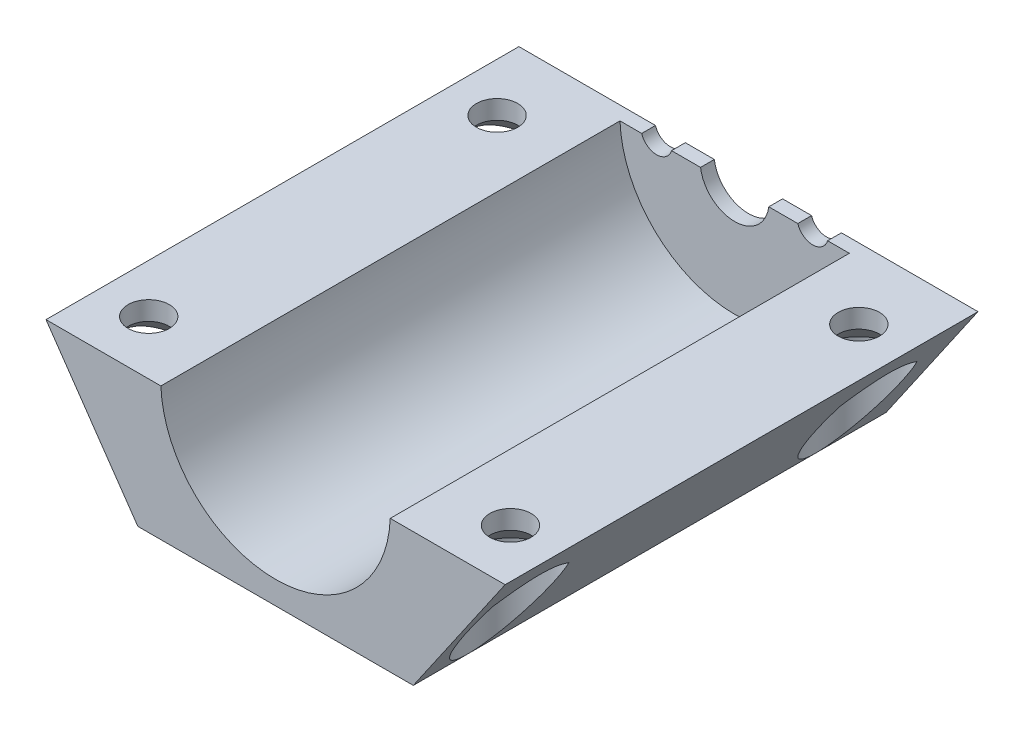
ISO-10303-21;
HEADER;
FILE_DESCRIPTION(('STEP AP214'),'2;1');
FILE_NAME('part.step','',(''),(''),'','','');
FILE_SCHEMA(('AUTOMOTIVE_DESIGN { 1 0 10303 214 1 1 1 1 }'));
ENDSEC;
DATA;
#1=APPLICATION_CONTEXT('core data for automotive mechanical design processes');
#2=APPLICATION_PROTOCOL_DEFINITION('international standard','automotive_design',2000,#1);
#3=PRODUCT_CONTEXT('',#1,'mechanical');
#4=PRODUCT('Part','Part','',(#3));
#5=PRODUCT_RELATED_PRODUCT_CATEGORY('part','',(#4));
#6=PRODUCT_DEFINITION_FORMATION('','',#4);
#7=PRODUCT_DEFINITION_CONTEXT('part definition',#1,'design');
#8=PRODUCT_DEFINITION('design','',#6,#7);
#9=PRODUCT_DEFINITION_SHAPE('','',#8);
#10=(LENGTH_UNIT() NAMED_UNIT(*) SI_UNIT(.MILLI.,.METRE.));
#11=(NAMED_UNIT(*) PLANE_ANGLE_UNIT() SI_UNIT($,.RADIAN.));
#12=(NAMED_UNIT(*) SI_UNIT($,.STERADIAN.) SOLID_ANGLE_UNIT());
#13=UNCERTAINTY_MEASURE_WITH_UNIT(LENGTH_MEASURE(1.E-05),#10,'distance_accuracy_value','');
#14=(GEOMETRIC_REPRESENTATION_CONTEXT(3) GLOBAL_UNCERTAINTY_ASSIGNED_CONTEXT((#13)) GLOBAL_UNIT_ASSIGNED_CONTEXT((#10,
#11,#12)) REPRESENTATION_CONTEXT('',''));
#15=CARTESIAN_POINT('',(0.,0.,0.));
#16=DIRECTION('',(0.,0.,1.));
#17=DIRECTION('',(1.,0.,0.));
#18=AXIS2_PLACEMENT_3D('',#15,#16,#17);
#19=CARTESIAN_POINT('',(0.,-0.499999999999995,0.));
#20=DIRECTION('',(0.,1.,0.));
#21=DIRECTION('',(0.,0.,1.));
#22=AXIS2_PLACEMENT_3D('',#19,#20,#21);
#23=PLANE('',#22);
#24=DIRECTION('',(0.,0.,1.));
#25=VECTOR('',#24,1.);
#26=CARTESIAN_POINT('',(-3.71651718682963,-0.499999999999995,-1.5));
#27=LINE('',#26,#25);
#28=CARTESIAN_POINT('',(-3.71651718682963,-0.499999999999995,-1.5));
#29=VERTEX_POINT('',#28);
#30=CARTESIAN_POINT('',(-3.71651718682963,-0.499999999999995,0.));
#31=VERTEX_POINT('',#30);
#32=EDGE_CURVE('E268',#29,#31,#27,.T.);
#33=ORIENTED_EDGE('',*,*,#32,.F.);
#34=DIRECTION('',(-1.,0.,0.));
#35=VECTOR('',#34,1.);
#36=CARTESIAN_POINT('',(0.,-0.499999999999995,-1.5));
#37=LINE('',#36,#35);
#38=CARTESIAN_POINT('',(-6.87519231907281,-0.499999999999996,-1.5));
#39=VERTEX_POINT('',#38);
#40=EDGE_CURVE('E250',#29,#39,#37,.T.);
#41=ORIENTED_EDGE('',*,*,#40,.T.);
#42=DIRECTION('',(0.,0.,-1.));
#43=VECTOR('',#42,1.);
#44=CARTESIAN_POINT('',(-6.87519231907281,-0.499999999999995,-1.5));
#45=LINE('',#44,#43);
#46=CARTESIAN_POINT('',(-6.87519231907281,-0.499999999999995,0.));
#47=VERTEX_POINT('',#46);
#48=EDGE_CURVE('E244',#39,#47,#45,.F.);
#49=ORIENTED_EDGE('',*,*,#48,.T.);
#50=DIRECTION('',(-1.,0.,0.));
#51=VECTOR('',#50,1.);
#52=CARTESIAN_POINT('',(0.,-0.499999999999995,0.));
#53=LINE('',#52,#51);
#54=EDGE_CURVE('E496',#31,#47,#53,.T.);
#55=ORIENTED_EDGE('',*,*,#54,.F.);
#56=EDGE_LOOP('',(#33,#41,#49,#55));
#57=FACE_BOUND('',#56,.T.);
#58=ADVANCED_FACE('F39',(#57),#23,.T.);
#59=CARTESIAN_POINT('',(-19.6986749407734,-0.499999999999995,44.1150104980837));
#60=DIRECTION('',(0.,1.,0.));
#61=DIRECTION('',(0.,0.,1.));
#62=AXIS2_PLACEMENT_3D('',#59,#60,#61);
#63=CIRCLE('',#62,2.25);
#64=CARTESIAN_POINT('',(-19.6986749407734,-0.499999999999995,46.3650104980837));
#65=VERTEX_POINT('',#64);
#66=EDGE_CURVE('E256',#65,#65,#63,.F.);
#67=ORIENTED_EDGE('',*,*,#66,.T.);
#68=EDGE_LOOP('',(#67));
#69=FACE_BOUND('',#68,.T.);
#70=DIRECTION('',(-1.,0.,0.));
#71=VECTOR('',#70,1.);
#72=CARTESIAN_POINT('',(0.,-0.499999999999995,50.));
#73=LINE('',#72,#71);
#74=CARTESIAN_POINT('',(-12.4899959967968,-0.499999999999995,50.));
#75=VERTEX_POINT('',#74);
#76=CARTESIAN_POINT('',(-25.,-0.500000000000001,50.));
#77=VERTEX_POINT('',#76);
#78=EDGE_CURVE('E239',#75,#77,#73,.T.);
#79=ORIENTED_EDGE('',*,*,#78,.F.);
#80=DIRECTION('',(0.,0.,-1.));
#81=VECTOR('',#80,1.);
#82=CARTESIAN_POINT('',(-12.4899959967968,-0.499999999999995,50.));
#83=LINE('',#82,#81);
#84=CARTESIAN_POINT('',(-12.4899959967968,-0.499999999999995,0.));
#85=VERTEX_POINT('',#84);
#86=EDGE_CURVE('E264',#85,#75,#83,.F.);
#87=ORIENTED_EDGE('',*,*,#86,.F.);
#88=CARTESIAN_POINT('',(-10.1248076809272,-0.499999999999995,0.));
#89=VERTEX_POINT('',#88);
#90=EDGE_CURVE('E241',#89,#85,#53,.T.);
#91=ORIENTED_EDGE('',*,*,#90,.F.);
#92=DIRECTION('',(0.,0.,-1.));
#93=VECTOR('',#92,1.);
#94=CARTESIAN_POINT('',(-10.1248076809272,-0.499999999999995,-1.5));
#95=LINE('',#94,#93);
#96=CARTESIAN_POINT('',(-10.1248076809272,-0.499999999999996,-1.5));
#97=VERTEX_POINT('',#96);
#98=EDGE_CURVE('E242',#89,#97,#95,.T.);
#99=ORIENTED_EDGE('',*,*,#98,.T.);
#100=CARTESIAN_POINT('',(-25.,-0.500000000000001,-1.5));
#101=VERTEX_POINT('',#100);
#102=EDGE_CURVE('E197',#97,#101,#37,.T.);
#103=ORIENTED_EDGE('',*,*,#102,.T.);
#104=DIRECTION('',(0.,0.,-1.));
#105=VECTOR('',#104,1.);
#106=CARTESIAN_POINT('',(-25.,-0.500000000000001,50.));
#107=LINE('',#106,#105);
#108=EDGE_CURVE('E273',#77,#101,#107,.T.);
#109=ORIENTED_EDGE('',*,*,#108,.F.);
#110=EDGE_LOOP('',(#79,#87,#91,#99,#103,#109));
#111=FACE_BOUND('',#110,.T.);
#112=CARTESIAN_POINT('',(-19.6986749407734,-0.499999999999995,6.17682172326088));
#113=DIRECTION('',(0.,1.,0.));
#114=DIRECTION('',(0.,0.,1.));
#115=AXIS2_PLACEMENT_3D('',#112,#113,#114);
#116=CIRCLE('',#115,2.25);
#117=CARTESIAN_POINT('',(-19.6986749407734,-0.499999999999995,8.42682172326087));
#118=VERTEX_POINT('',#117);
#119=EDGE_CURVE('E253',#118,#118,#116,.F.);
#120=ORIENTED_EDGE('',*,*,#119,.T.);
#121=EDGE_LOOP('',(#120));
#122=FACE_BOUND('',#121,.T.);
#123=ADVANCED_FACE('F390',(#69,#111,#122),#23,.T.);
#124=CARTESIAN_POINT('',(19.6986749407734,-0.499999999999995,44.1150104980837));
#125=DIRECTION('',(0.,1.,0.));
#126=DIRECTION('',(0.,0.,1.));
#127=AXIS2_PLACEMENT_3D('',#124,#125,#126);
#128=CIRCLE('',#127,2.25);
#129=CARTESIAN_POINT('',(19.6986749407734,-0.499999999999995,46.3650104980837));
#130=VERTEX_POINT('',#129);
#131=EDGE_CURVE('E259',#130,#130,#128,.F.);
#132=ORIENTED_EDGE('',*,*,#131,.T.);
#133=EDGE_LOOP('',(#132));
#134=FACE_BOUND('',#133,.T.);
#135=CARTESIAN_POINT('',(25.,-0.499999999999995,50.));
#136=VERTEX_POINT('',#135);
#137=CARTESIAN_POINT('',(12.4899959967968,-0.499999999999995,50.));
#138=VERTEX_POINT('',#137);
#139=EDGE_CURVE('E202',#136,#138,#73,.T.);
#140=ORIENTED_EDGE('',*,*,#139,.F.);
#141=DIRECTION('',(0.,0.,-1.));
#142=VECTOR('',#141,1.);
#143=CARTESIAN_POINT('',(25.,-0.499999999999995,50.));
#144=LINE('',#143,#142);
#145=CARTESIAN_POINT('',(25.,-0.499999999999995,-1.5));
#146=VERTEX_POINT('',#145);
#147=EDGE_CURVE('E182',#136,#146,#144,.T.);
#148=ORIENTED_EDGE('',*,*,#147,.T.);
#149=CARTESIAN_POINT('',(10.1248076809272,-0.499999999999996,-1.5));
#150=VERTEX_POINT('',#149);
#151=EDGE_CURVE('E188',#146,#150,#37,.T.);
#152=ORIENTED_EDGE('',*,*,#151,.T.);
#153=DIRECTION('',(0.,0.,-1.));
#154=VECTOR('',#153,1.);
#155=CARTESIAN_POINT('',(10.1248076809272,-0.499999999999995,-1.5));
#156=LINE('',#155,#154);
#157=CARTESIAN_POINT('',(10.1248076809272,-0.499999999999995,0.));
#158=VERTEX_POINT('',#157);
#159=EDGE_CURVE('E206',#150,#158,#156,.F.);
#160=ORIENTED_EDGE('',*,*,#159,.T.);
#161=CARTESIAN_POINT('',(12.4899959967968,-0.499999999999995,0.));
#162=VERTEX_POINT('',#161);
#163=EDGE_CURVE('E234',#162,#158,#53,.T.);
#164=ORIENTED_EDGE('',*,*,#163,.F.);
#165=DIRECTION('',(0.,0.,-1.));
#166=VECTOR('',#165,1.);
#167=CARTESIAN_POINT('',(12.4899959967968,-0.499999999999995,50.));
#168=LINE('',#167,#166);
#169=EDGE_CURVE('E262',#138,#162,#168,.T.);
#170=ORIENTED_EDGE('',*,*,#169,.F.);
#171=EDGE_LOOP('',(#140,#148,#152,#160,#164,#170));
#172=FACE_BOUND('',#171,.T.);
#173=CARTESIAN_POINT('',(19.6986749407734,-0.499999999999995,6.17682172326088));
#174=DIRECTION('',(0.,1.,0.));
#175=DIRECTION('',(0.,0.,1.));
#176=AXIS2_PLACEMENT_3D('',#173,#174,#175);
#177=CIRCLE('',#176,2.25);
#178=CARTESIAN_POINT('',(19.6986749407734,-0.499999999999995,8.42682172326087));
#179=VERTEX_POINT('',#178);
#180=EDGE_CURVE('E194',#179,#179,#177,.F.);
#181=ORIENTED_EDGE('',*,*,#180,.T.);
#182=EDGE_LOOP('',(#181));
#183=FACE_BOUND('',#182,.T.);
#184=ADVANCED_FACE('F199',(#134,#172,#183),#23,.T.);
#185=DIRECTION('',(0.,0.,1.));
#186=VECTOR('',#185,1.);
#187=CARTESIAN_POINT('',(3.71651718682963,-0.499999999999995,-1.5));
#188=LINE('',#187,#186);
#189=CARTESIAN_POINT('',(3.71651718682963,-0.499999999999995,0.));
#190=VERTEX_POINT('',#189);
#191=CARTESIAN_POINT('',(3.71651718682963,-0.499999999999995,-1.5));
#192=VERTEX_POINT('',#191);
#193=EDGE_CURVE('E270',#190,#192,#188,.F.);
#194=ORIENTED_EDGE('',*,*,#193,.F.);
#195=CARTESIAN_POINT('',(6.87519231907281,-0.499999999999995,0.));
#196=VERTEX_POINT('',#195);
#197=EDGE_CURVE('E238',#196,#190,#53,.T.);
#198=ORIENTED_EDGE('',*,*,#197,.F.);
#199=DIRECTION('',(0.,0.,-1.));
#200=VECTOR('',#199,1.);
#201=CARTESIAN_POINT('',(6.87519231907281,-0.499999999999995,-1.5));
#202=LINE('',#201,#200);
#203=CARTESIAN_POINT('',(6.87519231907281,-0.499999999999996,-1.5));
#204=VERTEX_POINT('',#203);
#205=EDGE_CURVE('E203',#196,#204,#202,.T.);
#206=ORIENTED_EDGE('',*,*,#205,.T.);
#207=EDGE_CURVE('E195',#204,#192,#37,.T.);
#208=ORIENTED_EDGE('',*,*,#207,.T.);
#209=EDGE_LOOP('',(#194,#198,#206,#208));
#210=FACE_BOUND('',#209,.T.);
#211=ADVANCED_FACE('F379',(#210),#23,.T.);
#212=CARTESIAN_POINT('',(0.,0.,50.));
#213=DIRECTION('',(0.,0.,-1.));
#214=DIRECTION('',(-1.,0.,0.));
#215=AXIS2_PLACEMENT_3D('',#212,#213,#214);
#216=CYLINDRICAL_SURFACE('',#215,12.5);
#217=CARTESIAN_POINT('',(0.,0.,50.));
#218=DIRECTION('',(0.,0.,1.));
#219=DIRECTION('',(1.,0.,0.));
#220=AXIS2_PLACEMENT_3D('',#217,#218,#219);
#221=CIRCLE('',#220,12.5);
#222=EDGE_CURVE('E210',#75,#138,#221,.T.);
#223=ORIENTED_EDGE('',*,*,#222,.T.);
#224=ORIENTED_EDGE('',*,*,#169,.T.);
#225=CARTESIAN_POINT('',(0.,0.,0.));
#226=DIRECTION('',(0.,0.,1.));
#227=DIRECTION('',(1.,0.,0.));
#228=AXIS2_PLACEMENT_3D('',#225,#226,#227);
#229=CIRCLE('',#228,12.5);
#230=EDGE_CURVE('E214',#85,#162,#229,.T.);
#231=ORIENTED_EDGE('',*,*,#230,.F.);
#232=ORIENTED_EDGE('',*,*,#86,.T.);
#233=EDGE_LOOP('',(#223,#224,#231,#232));
#234=FACE_BOUND('',#233,.T.);
#235=ADVANCED_FACE('F377',(#234),#216,.F.);
#236=CARTESIAN_POINT('',(0.,0.,50.));
#237=DIRECTION('',(0.,0.,1.));
#238=DIRECTION('',(1.,0.,0.));
#239=AXIS2_PLACEMENT_3D('',#236,#237,#238);
#240=PLANE('',#239);
#241=DIRECTION('',(0.567732955803659,0.823212785915306,0.));
#242=VECTOR('',#241,1.);
#243=CARTESIAN_POINT('',(17.1756647864625,-11.8452860596293,50.));
#244=LINE('',#243,#242);
#245=CARTESIAN_POINT('',(15.,-15.,50.));
#246=VERTEX_POINT('',#245);
#247=EDGE_CURVE('E213',#246,#136,#244,.T.);
#248=ORIENTED_EDGE('',*,*,#247,.T.);
#249=ORIENTED_EDGE('',*,*,#139,.T.);
#250=ORIENTED_EDGE('',*,*,#222,.F.);
#251=ORIENTED_EDGE('',*,*,#78,.T.);
#252=DIRECTION('',(0.56773295580366,-0.823212785915306,0.));
#253=VECTOR('',#252,1.);
#254=CARTESIAN_POINT('',(-17.1756647864625,-11.8452860596293,50.));
#255=LINE('',#254,#253);
#256=CARTESIAN_POINT('',(-15.,-15.,50.));
#257=VERTEX_POINT('',#256);
#258=EDGE_CURVE('E218',#77,#257,#255,.T.);
#259=ORIENTED_EDGE('',*,*,#258,.T.);
#260=DIRECTION('',(-1.,0.,0.));
#261=VECTOR('',#260,1.);
#262=CARTESIAN_POINT('',(0.,-15.,50.));
#263=LINE('',#262,#261);
#264=EDGE_CURVE('E310',#246,#257,#263,.T.);
#265=ORIENTED_EDGE('',*,*,#264,.F.);
#266=EDGE_LOOP('',(#248,#249,#250,#251,#259,#265));
#267=FACE_BOUND('',#266,.T.);
#268=ADVANCED_FACE('F41',(#267),#240,.T.);
#269=CARTESIAN_POINT('',(19.6986749407734,-15.,44.1150104980837));
#270=DIRECTION('',(0.,-1.,0.));
#271=DIRECTION('',(0.,0.,-1.));
#272=AXIS2_PLACEMENT_3D('',#269,#270,#271);
#273=CYLINDRICAL_SURFACE('',#272,2.25);
#274=CARTESIAN_POINT('',(19.6986749407734,-2.55,44.1150104980837));
#275=DIRECTION('',(0.,-1.,0.));
#276=DIRECTION('',(0.,0.,-1.));
#277=AXIS2_PLACEMENT_3D('',#274,#275,#276);
#278=CIRCLE('',#277,2.25);
#279=CARTESIAN_POINT('',(19.6986749407734,-2.55,41.8650104980837));
#280=VERTEX_POINT('',#279);
#281=EDGE_CURVE('E217',#280,#280,#278,.T.);
#282=ORIENTED_EDGE('',*,*,#281,.T.);
#283=EDGE_LOOP('',(#282));
#284=FACE_BOUND('',#283,.T.);
#285=ORIENTED_EDGE('',*,*,#131,.F.);
#286=EDGE_LOOP('',(#285));
#287=FACE_BOUND('',#286,.T.);
#288=ADVANCED_FACE('F386',(#284,#287),#273,.F.);
#289=CARTESIAN_POINT('',(-19.6986749407734,-15.,44.1150104980837));
#290=DIRECTION('',(0.,-1.,0.));
#291=DIRECTION('',(0.,0.,-1.));
#292=AXIS2_PLACEMENT_3D('',#289,#290,#291);
#293=CYLINDRICAL_SURFACE('',#292,2.25);
#294=CARTESIAN_POINT('',(-19.6986749407734,-2.55000000000001,44.1150104980837));
#295=DIRECTION('',(0.,-1.,0.));
#296=DIRECTION('',(0.,0.,-1.));
#297=AXIS2_PLACEMENT_3D('',#294,#295,#296);
#298=CIRCLE('',#297,2.25);
#299=CARTESIAN_POINT('',(-19.6986749407734,-2.55000000000001,41.8650104980837));
#300=VERTEX_POINT('',#299);
#301=EDGE_CURVE('E300',#300,#300,#298,.T.);
#302=ORIENTED_EDGE('',*,*,#301,.T.);
#303=EDGE_LOOP('',(#302));
#304=FACE_BOUND('',#303,.T.);
#305=ORIENTED_EDGE('',*,*,#66,.F.);
#306=EDGE_LOOP('',(#305));
#307=FACE_BOUND('',#306,.T.);
#308=ADVANCED_FACE('F414',(#304,#307),#293,.F.);
#309=CARTESIAN_POINT('',(-19.6986749407734,-15.,6.17682172326088));
#310=DIRECTION('',(0.,-1.,0.));
#311=DIRECTION('',(0.,0.,-1.));
#312=AXIS2_PLACEMENT_3D('',#309,#310,#311);
#313=CYLINDRICAL_SURFACE('',#312,2.25);
#314=CARTESIAN_POINT('',(-19.6986749407734,-2.55000000000001,6.17682172326088));
#315=DIRECTION('',(0.,-1.,0.));
#316=DIRECTION('',(0.,0.,-1.));
#317=AXIS2_PLACEMENT_3D('',#314,#315,#316);
#318=CIRCLE('',#317,2.25);
#319=CARTESIAN_POINT('',(-19.6986749407734,-2.55000000000001,3.92682172326088));
#320=VERTEX_POINT('',#319);
#321=EDGE_CURVE('E292',#320,#320,#318,.T.);
#322=ORIENTED_EDGE('',*,*,#321,.T.);
#323=EDGE_LOOP('',(#322));
#324=FACE_BOUND('',#323,.T.);
#325=ORIENTED_EDGE('',*,*,#119,.F.);
#326=EDGE_LOOP('',(#325));
#327=FACE_BOUND('',#326,.T.);
#328=ADVANCED_FACE('F410',(#324,#327),#313,.F.);
#329=CARTESIAN_POINT('',(19.6986749407734,-15.,6.17682172326088));
#330=DIRECTION('',(0.,-1.,0.));
#331=DIRECTION('',(0.,0.,-1.));
#332=AXIS2_PLACEMENT_3D('',#329,#330,#331);
#333=CYLINDRICAL_SURFACE('',#332,2.25);
#334=CARTESIAN_POINT('',(19.6986749407734,-2.55,6.17682172326088));
#335=DIRECTION('',(0.,-1.,0.));
#336=DIRECTION('',(0.,0.,-1.));
#337=AXIS2_PLACEMENT_3D('',#334,#335,#336);
#338=CIRCLE('',#337,2.25);
#339=CARTESIAN_POINT('',(19.6986749407734,-2.55,3.92682172326088));
#340=VERTEX_POINT('',#339);
#341=EDGE_CURVE('E285',#340,#340,#338,.T.);
#342=ORIENTED_EDGE('',*,*,#341,.T.);
#343=EDGE_LOOP('',(#342));
#344=FACE_BOUND('',#343,.T.);
#345=ORIENTED_EDGE('',*,*,#180,.F.);
#346=EDGE_LOOP('',(#345));
#347=FACE_BOUND('',#346,.T.);
#348=ADVANCED_FACE('F395',(#344,#347),#333,.F.);
#349=CARTESIAN_POINT('',(0.,0.,0.));
#350=DIRECTION('',(0.,0.,1.));
#351=DIRECTION('',(1.,0.,0.));
#352=AXIS2_PLACEMENT_3D('',#349,#350,#351);
#353=PLANE('',#352);
#354=ORIENTED_EDGE('',*,*,#230,.T.);
#355=ORIENTED_EDGE('',*,*,#163,.T.);
#356=CARTESIAN_POINT('',(8.5,0.,0.));
#357=DIRECTION('',(0.,0.,1.));
#358=DIRECTION('',(1.,0.,0.));
#359=AXIS2_PLACEMENT_3D('',#356,#357,#358);
#360=CIRCLE('',#359,1.7);
#361=EDGE_CURVE('E47',#196,#158,#360,.T.);
#362=ORIENTED_EDGE('',*,*,#361,.F.);
#363=ORIENTED_EDGE('',*,*,#197,.T.);
#364=CARTESIAN_POINT('',(0.,0.,0.));
#365=DIRECTION('',(0.,0.,-1.));
#366=DIRECTION('',(-1.,0.,0.));
#367=AXIS2_PLACEMENT_3D('',#364,#365,#366);
#368=CIRCLE('',#367,3.75);
#369=EDGE_CURVE('E221',#190,#31,#368,.T.);
#370=ORIENTED_EDGE('',*,*,#369,.T.);
#371=ORIENTED_EDGE('',*,*,#54,.T.);
#372=CARTESIAN_POINT('',(-8.5,0.,0.));
#373=DIRECTION('',(0.,0.,1.));
#374=DIRECTION('',(1.,0.,0.));
#375=AXIS2_PLACEMENT_3D('',#372,#373,#374);
#376=CIRCLE('',#375,1.7);
#377=EDGE_CURVE('E224',#89,#47,#376,.T.);
#378=ORIENTED_EDGE('',*,*,#377,.F.);
#379=ORIENTED_EDGE('',*,*,#90,.T.);
#380=EDGE_LOOP('',(#354,#355,#362,#363,#370,#371,#378,#379));
#381=FACE_BOUND('',#380,.T.);
#382=ADVANCED_FACE('F235',(#381),#353,.T.);
#383=CARTESIAN_POINT('',(0.,0.,-1.5));
#384=DIRECTION('',(0.,0.,1.));
#385=DIRECTION('',(1.,0.,0.));
#386=AXIS2_PLACEMENT_3D('',#383,#384,#385);
#387=PLANE('',#386);
#388=ORIENTED_EDGE('',*,*,#151,.F.);
#389=DIRECTION('',(-0.567732955803659,-0.823212785915306,0.));
#390=VECTOR('',#389,1.);
#391=CARTESIAN_POINT('',(15.,-15.,-1.5));
#392=LINE('',#391,#390);
#393=CARTESIAN_POINT('',(15.,-15.,-1.5));
#394=VERTEX_POINT('',#393);
#395=EDGE_CURVE('E176',#146,#394,#392,.T.);
#396=ORIENTED_EDGE('',*,*,#395,.T.);
#397=DIRECTION('',(-1.,0.,0.));
#398=VECTOR('',#397,1.);
#399=CARTESIAN_POINT('',(-15.,-15.,-1.5));
#400=LINE('',#399,#398);
#401=CARTESIAN_POINT('',(-15.,-15.,-1.5));
#402=VERTEX_POINT('',#401);
#403=EDGE_CURVE('E185',#394,#402,#400,.T.);
#404=ORIENTED_EDGE('',*,*,#403,.T.);
#405=DIRECTION('',(-0.56773295580366,0.823212785915306,0.));
#406=VECTOR('',#405,1.);
#407=CARTESIAN_POINT('',(-25.,-0.500000000000001,-1.5));
#408=LINE('',#407,#406);
#409=EDGE_CURVE('E278',#402,#101,#408,.T.);
#410=ORIENTED_EDGE('',*,*,#409,.T.);
#411=ORIENTED_EDGE('',*,*,#102,.F.);
#412=CARTESIAN_POINT('',(-8.5,0.,-1.5));
#413=DIRECTION('',(0.,0.,-1.));
#414=DIRECTION('',(-1.,0.,0.));
#415=AXIS2_PLACEMENT_3D('',#412,#413,#414);
#416=CIRCLE('',#415,1.7);
#417=EDGE_CURVE('E226',#39,#97,#416,.T.);
#418=ORIENTED_EDGE('',*,*,#417,.F.);
#419=ORIENTED_EDGE('',*,*,#40,.F.);
#420=CARTESIAN_POINT('',(0.,0.,-1.5));
#421=DIRECTION('',(0.,0.,-1.));
#422=DIRECTION('',(-1.,0.,0.));
#423=AXIS2_PLACEMENT_3D('',#420,#421,#422);
#424=CIRCLE('',#423,3.75);
#425=EDGE_CURVE('E184',#192,#29,#424,.T.);
#426=ORIENTED_EDGE('',*,*,#425,.F.);
#427=ORIENTED_EDGE('',*,*,#207,.F.);
#428=CARTESIAN_POINT('',(8.5,0.,-1.5));
#429=DIRECTION('',(0.,0.,-1.));
#430=DIRECTION('',(-1.,0.,0.));
#431=AXIS2_PLACEMENT_3D('',#428,#429,#430);
#432=CIRCLE('',#431,1.7);
#433=EDGE_CURVE('E11',#150,#204,#432,.T.);
#434=ORIENTED_EDGE('',*,*,#433,.F.);
#435=EDGE_LOOP('',(#388,#396,#404,#410,#411,#418,#419,#426,#427,#434));
#436=FACE_BOUND('',#435,.T.);
#437=ADVANCED_FACE('F189',(#436),#387,.F.);
#438=CARTESIAN_POINT('',(0.,0.,-1.5));
#439=DIRECTION('',(0.,0.,1.));
#440=DIRECTION('',(1.,0.,0.));
#441=AXIS2_PLACEMENT_3D('',#438,#439,#440);
#442=CYLINDRICAL_SURFACE('',#441,3.75);
#443=ORIENTED_EDGE('',*,*,#425,.T.);
#444=ORIENTED_EDGE('',*,*,#32,.T.);
#445=ORIENTED_EDGE('',*,*,#369,.F.);
#446=ORIENTED_EDGE('',*,*,#193,.T.);
#447=EDGE_LOOP('',(#443,#444,#445,#446));
#448=FACE_BOUND('',#447,.T.);
#449=ADVANCED_FACE('F398',(#448),#442,.F.);
#450=CARTESIAN_POINT('',(-8.5,0.,-1.5));
#451=DIRECTION('',(0.,0.,-1.));
#452=DIRECTION('',(-1.,0.,0.));
#453=AXIS2_PLACEMENT_3D('',#450,#451,#452);
#454=CYLINDRICAL_SURFACE('',#453,1.7);
#455=ORIENTED_EDGE('',*,*,#48,.F.);
#456=ORIENTED_EDGE('',*,*,#417,.T.);
#457=ORIENTED_EDGE('',*,*,#98,.F.);
#458=ORIENTED_EDGE('',*,*,#377,.T.);
#459=EDGE_LOOP('',(#455,#456,#457,#458));
#460=FACE_BOUND('',#459,.T.);
#461=ADVANCED_FACE('F401',(#460),#454,.F.);
#462=CARTESIAN_POINT('',(8.5,0.,-1.5));
#463=DIRECTION('',(0.,0.,-1.));
#464=DIRECTION('',(-1.,0.,0.));
#465=AXIS2_PLACEMENT_3D('',#462,#463,#464);
#466=CYLINDRICAL_SURFACE('',#465,1.7);
#467=ORIENTED_EDGE('',*,*,#159,.F.);
#468=ORIENTED_EDGE('',*,*,#433,.T.);
#469=ORIENTED_EDGE('',*,*,#205,.F.);
#470=ORIENTED_EDGE('',*,*,#361,.T.);
#471=EDGE_LOOP('',(#467,#468,#469,#470));
#472=FACE_BOUND('',#471,.T.);
#473=ADVANCED_FACE('F230',(#472),#466,.F.);
#474=CARTESIAN_POINT('',(-17.1756647864625,-11.8452860596293,50.));
#475=DIRECTION('',(0.823212785915306,0.56773295580366,0.));
#476=DIRECTION('',(-0.56773295580366,0.823212785915306,0.));
#477=AXIS2_PLACEMENT_3D('',#474,#475,#476);
#478=PLANE('',#477);
#479=DIRECTION('',(0.,0.,-1.));
#480=VECTOR('',#479,1.);
#481=CARTESIAN_POINT('',(-15.,-15.,50.));
#482=LINE('',#481,#480);
#483=CARTESIAN_POINT('',(-15.,-15.,6.06522512408229));
#484=VERTEX_POINT('',#483);
#485=EDGE_CURVE('E62',#484,#402,#482,.T.);
#486=ORIENTED_EDGE('',*,*,#485,.F.);
#487=CARTESIAN_POINT('',(-19.6986749407734,-8.18692133587859,6.17682172326088));
#488=DIRECTION('',(0.823212785915306,0.56773295580366,0.));
#489=DIRECTION('',(0.56773295580366,-0.823212785915306,0.));
#490=AXIS2_PLACEMENT_3D('',#487,#488,#489);
#491=ELLIPSE('',#490,8.27854002829001,4.7);
#492=CARTESIAN_POINT('',(-21.8965517241379,-5.00000000000001,2.02238582350901));
#493=VERTEX_POINT('',#492);
#494=EDGE_CURVE('E454',#484,#493,#491,.T.);
#495=ORIENTED_EDGE('',*,*,#494,.T.);
#496=CARTESIAN_POINT('',(-21.8964137931034,-5.00020000000001,2.02208659608864));
#497=CARTESIAN_POINT('',(-21.9373934271764,-4.94077953059417,2.11099607729211));
#498=CARTESIAN_POINT('',(-21.9777748105248,-4.88222652473908,2.20077196587641));
#499=CARTESIAN_POINT('',(-22.0571709610869,-4.76710210642407,2.38221815874885));
#500=CARTESIAN_POINT('',(-22.0961853373366,-4.71053126086198,2.47388899326357));
#501=CARTESIAN_POINT('',(-22.1728379380114,-4.59938498988347,2.65968246153815));
#502=CARTESIAN_POINT('',(-22.2104686345403,-4.54482047991664,2.75381477289246));
#503=CARTESIAN_POINT('',(-22.2839235687901,-4.43831082525439,2.94422576701021));
#504=CARTESIAN_POINT('',(-22.3197479423952,-4.38636548352702,3.04050428753281));
#505=CARTESIAN_POINT('',(-22.4257208302335,-4.2327047961614,3.3371804711165));
#506=CARTESIAN_POINT('',(-22.4926198969123,-4.13570114947711,3.54125112017009));
#507=CARTESIAN_POINT('',(-22.6150268275729,-3.95821110001936,3.9594312417019));
#508=CARTESIAN_POINT('',(-22.6705574585779,-3.87769168506198,4.1735195739858));
#509=CARTESIAN_POINT('',(-22.746876536482,-3.76702902210104,4.52026274031542));
#510=CARTESIAN_POINT('',(-22.7724942725224,-3.72988330484246,4.64963065789284));
#511=CARTESIAN_POINT('',(-22.8180673442797,-3.66380235079447,4.91147036485367));
#512=CARTESIAN_POINT('',(-22.8380223406349,-3.63486760607939,5.04394233974492));
#513=CARTESIAN_POINT('',(-22.8714737810932,-3.58636301741493,5.31032470265428));
#514=CARTESIAN_POINT('',(-22.8850196154814,-3.56672155755191,5.44421568146456));
#515=CARTESIAN_POINT('',(-22.9053755645646,-3.53720543138133,5.71358576473854));
#516=CARTESIAN_POINT('',(-22.9121861134567,-3.52733013548784,5.84906476625888));
#517=CARTESIAN_POINT('',(-22.9188159383459,-3.5177168893984,6.12149679094143));
#518=CARTESIAN_POINT('',(-22.9185866142384,-3.51804940935436,6.25845353268023));
#519=CARTESIAN_POINT('',(-22.9110264652226,-3.52901162542721,6.53175163809029));
#520=CARTESIAN_POINT('',(-22.903695538333,-3.53964146941715,6.66809299289612));
#521=CARTESIAN_POINT('',(-22.8822021744114,-3.57080684710348,6.93950185027654));
#522=CARTESIAN_POINT('',(-22.8680190073661,-3.5913724393192,7.0745642110391));
#523=CARTESIAN_POINT('',(-22.8333502818238,-3.64164209135553,7.34214032919437));
#524=CARTESIAN_POINT('',(-22.8128638985143,-3.67134734715424,7.4746537506309));
#525=CARTESIAN_POINT('',(-22.7574796690486,-3.75165447987956,7.7858508191377));
#526=CARTESIAN_POINT('',(-22.7200597192865,-3.80591340703454,7.96314295498938));
#527=CARTESIAN_POINT('',(-22.6363785439314,-3.92725111129942,8.31112566688612));
#528=CARTESIAN_POINT('',(-22.5901124004487,-3.99433701934934,8.48181250706498));
#529=CARTESIAN_POINT('',(-22.4903273841325,-4.13902529300784,8.81693326988787));
#530=CARTESIAN_POINT('',(-22.436791364168,-4.21665252195643,8.98135119525801));
#531=CARTESIAN_POINT('',(-22.3239900186616,-4.38021447294064,9.30385901442699));
#532=CARTESIAN_POINT('',(-22.2647262336835,-4.46614696115887,9.46195059369962));
#533=CARTESIAN_POINT('',(-22.1544716766579,-4.62601606884606,9.73995852175721));
#534=CARTESIAN_POINT('',(-22.1043422341814,-4.69870376043702,9.86094503992901));
#535=CARTESIAN_POINT('',(-22.0019370341949,-4.84719130041736,10.0989473947043));
#536=CARTESIAN_POINT('',(-21.9496757236123,-4.92297020076222,10.2159824826666));
#537=CARTESIAN_POINT('',(-21.8964137931034,-5.0002,10.3315568504331));
#538=B_SPLINE_CURVE_WITH_KNOTS('',3,(#496,#497,#498,#499,#500,#501,#502,#503,#504,#505,#506,
#507,#508,#509,#510,#511,#512,#513,#514,#515,#516,#517,#518,#519,#520,#521,#522,#523,#524,#525,
#526,#527,#528,#529,#530,#531,#532,#533,#534,#535,#536,#537),.UNSPECIFIED.,.F.,.F.,(4,2,2,2,2,2,
2,2,2,2,2,2,2,2,2,2,2,2,2,2,4),(0.,0.34356635423382,0.687230179454416,1.03254819810146,
1.37784020066393,2.08393733373427,2.78860626045945,3.19930436697554,3.61002708097046,
4.01753094644687,4.42500854004923,4.83529980353476,5.2455969590288,5.6571432298096,
6.06874337673223,6.63523820846969,7.20204889382847,7.77022049510812,8.33823970160977,
8.78748480662515,9.23407302310803),.UNSPECIFIED.);
#539=CARTESIAN_POINT('',(-21.8965517241379,-5.00000000000001,10.3312576230127));
#540=VERTEX_POINT('',#539);
#541=EDGE_CURVE('E360',#493,#540,#538,.T.);
#542=ORIENTED_EDGE('',*,*,#541,.T.);
#543=CARTESIAN_POINT('',(-15.,-15.,6.28841832243947));
#544=VERTEX_POINT('',#543);
#545=EDGE_CURVE('E456',#540,#544,#491,.T.);
#546=ORIENTED_EDGE('',*,*,#545,.T.);
#547=CARTESIAN_POINT('',(-15.,-15.,44.0034138989051));
#548=VERTEX_POINT('',#547);
#549=EDGE_CURVE('E320',#548,#544,#482,.T.);
#550=ORIENTED_EDGE('',*,*,#549,.F.);
#551=CARTESIAN_POINT('',(-19.6986749407734,-8.18692133587859,44.1150104980837));
#552=DIRECTION('',(0.823212785915306,0.56773295580366,0.));
#553=DIRECTION('',(0.56773295580366,-0.823212785915306,0.));
#554=AXIS2_PLACEMENT_3D('',#551,#552,#553);
#555=ELLIPSE('',#554,8.27854002829001,4.7);
#556=CARTESIAN_POINT('',(-21.8965517241379,-5.00000000000001,39.9605745983319));
#557=VERTEX_POINT('',#556);
#558=EDGE_CURVE('E359',#548,#557,#555,.T.);
#559=ORIENTED_EDGE('',*,*,#558,.T.);
#560=CARTESIAN_POINT('',(-21.8964137931034,-5.00020000000001,39.9602753709115));
#561=CARTESIAN_POINT('',(-21.9373934271764,-4.94077953059417,40.049184852115));
#562=CARTESIAN_POINT('',(-21.9777748105248,-4.88222652473908,40.1389607406993));
#563=CARTESIAN_POINT('',(-22.0571709610869,-4.76710210642406,40.3204069335717));
#564=CARTESIAN_POINT('',(-22.0961853373366,-4.71053126086198,40.4120777680864));
#565=CARTESIAN_POINT('',(-22.1728379380114,-4.59938498988347,40.597871236361));
#566=CARTESIAN_POINT('',(-22.2104686345403,-4.54482047991664,40.6920035477153));
#567=CARTESIAN_POINT('',(-22.2839235687901,-4.43831082525439,40.8824145418331));
#568=CARTESIAN_POINT('',(-22.3197479423952,-4.38636548352702,40.9786930623557));
#569=CARTESIAN_POINT('',(-22.4257208302335,-4.2327047961614,41.2753692459393));
#570=CARTESIAN_POINT('',(-22.4926198969123,-4.13570114947711,41.4794398949929));
#571=CARTESIAN_POINT('',(-22.6150268275729,-3.95821110001936,41.8976200165247));
#572=CARTESIAN_POINT('',(-22.6705574585779,-3.87769168506198,42.1117083488086));
#573=CARTESIAN_POINT('',(-22.746876536482,-3.76702902210104,42.4584515151383));
#574=CARTESIAN_POINT('',(-22.7724942725224,-3.72988330484246,42.5878194327157));
#575=CARTESIAN_POINT('',(-22.8180673442797,-3.66380235079447,42.8496591396765));
#576=CARTESIAN_POINT('',(-22.8380223406349,-3.63486760607939,42.9821311145678));
#577=CARTESIAN_POINT('',(-22.8714737810932,-3.58636301741493,43.2485134774771));
#578=CARTESIAN_POINT('',(-22.8850196154814,-3.56672155755191,43.3824044562874));
#579=CARTESIAN_POINT('',(-22.9053755645646,-3.53720543138133,43.6517745395614));
#580=CARTESIAN_POINT('',(-22.9121861134567,-3.52733013548784,43.7872535410817));
#581=CARTESIAN_POINT('',(-22.9188159383459,-3.5177168893984,44.0596855657643));
#582=CARTESIAN_POINT('',(-22.9185866142384,-3.51804940935436,44.1966423075031));
#583=CARTESIAN_POINT('',(-22.9110264652226,-3.52901162542721,44.4699404129131));
#584=CARTESIAN_POINT('',(-22.903695538333,-3.53964146941715,44.606281767719));
#585=CARTESIAN_POINT('',(-22.8822021744114,-3.57080684710348,44.8776906250994));
#586=CARTESIAN_POINT('',(-22.8680190073661,-3.5913724393192,45.0127529858619));
#587=CARTESIAN_POINT('',(-22.8333502818238,-3.64164209135553,45.2803291040172));
#588=CARTESIAN_POINT('',(-22.8128638985143,-3.67134734715424,45.4128425254537));
#589=CARTESIAN_POINT('',(-22.7574796690486,-3.75165447987956,45.7240395939605));
#590=CARTESIAN_POINT('',(-22.7200597192865,-3.80591340703454,45.9013317298122));
#591=CARTESIAN_POINT('',(-22.6363785439314,-3.92725111129942,46.249314441709));
#592=CARTESIAN_POINT('',(-22.5901124004487,-3.99433701934934,46.4200012818878));
#593=CARTESIAN_POINT('',(-22.4903273841325,-4.13902529300784,46.7551220447107));
#594=CARTESIAN_POINT('',(-22.436791364168,-4.21665252195643,46.9195399700809));
#595=CARTESIAN_POINT('',(-22.3239900186616,-4.38021447294064,47.2420477892498));
#596=CARTESIAN_POINT('',(-22.2647262336835,-4.46614696115888,47.4001393685225));
#597=CARTESIAN_POINT('',(-22.1544716766579,-4.62601606884606,47.6781472965801));
#598=CARTESIAN_POINT('',(-22.1043422341814,-4.69870376043702,47.7991338147519));
#599=CARTESIAN_POINT('',(-22.0019370341949,-4.84719130041736,48.0371361695271));
#600=CARTESIAN_POINT('',(-21.9496757236123,-4.92297020076222,48.1541712574895));
#601=CARTESIAN_POINT('',(-21.8964137931034,-5.0002,48.269745625256));
#602=B_SPLINE_CURVE_WITH_KNOTS('',3,(#560,#561,#562,#563,#564,#565,#566,#567,#568,#569,#570,
#571,#572,#573,#574,#575,#576,#577,#578,#579,#580,#581,#582,#583,#584,#585,#586,#587,#588,#589,
#590,#591,#592,#593,#594,#595,#596,#597,#598,#599,#600,#601),.UNSPECIFIED.,.F.,.F.,(4,2,2,2,2,2,
2,2,2,2,2,2,2,2,2,2,2,2,2,2,4),(0.,0.343566354233822,0.687230179454412,1.03254819810146,
1.37784020066392,2.08393733373428,2.78860626045945,3.19930436697553,3.61002708097045,
4.01753094644686,4.42500854004922,4.83529980353476,5.2455969590288,5.6571432298096,
6.06874337673223,6.63523820846969,7.20204889382846,7.77022049510813,8.33823970160977,
8.78748480662515,9.23407302310803),.UNSPECIFIED.);
#603=CARTESIAN_POINT('',(-21.8965517241379,-5.00000000000001,48.2694463978356));
#604=VERTEX_POINT('',#603);
#605=EDGE_CURVE('E350',#557,#604,#602,.T.);
#606=ORIENTED_EDGE('',*,*,#605,.T.);
#607=CARTESIAN_POINT('',(-15.,-15.,44.2266070972623));
#608=VERTEX_POINT('',#607);
#609=EDGE_CURVE('E358',#604,#608,#555,.T.);
#610=ORIENTED_EDGE('',*,*,#609,.T.);
#611=EDGE_CURVE('E274',#257,#608,#482,.T.);
#612=ORIENTED_EDGE('',*,*,#611,.F.);
#613=ORIENTED_EDGE('',*,*,#258,.F.);
#614=ORIENTED_EDGE('',*,*,#108,.T.);
#615=ORIENTED_EDGE('',*,*,#409,.F.);
#616=EDGE_LOOP('',(#486,#495,#542,#546,#550,#559,#606,#610,#612,#613,#614,#615));
#617=FACE_BOUND('',#616,.T.);
#618=ADVANCED_FACE('F366',(#617),#478,.F.);
#619=CARTESIAN_POINT('',(0.,-15.,50.));
#620=DIRECTION('',(0.,-1.,0.));
#621=DIRECTION('',(1.,0.,0.));
#622=AXIS2_PLACEMENT_3D('',#619,#620,#621);
#623=PLANE('',#622);
#624=CARTESIAN_POINT('',(19.6986749407734,-15.,6.17682172326088));
#625=DIRECTION('',(0.,-1.,0.));
#626=DIRECTION('',(0.,0.,-1.));
#627=AXIS2_PLACEMENT_3D('',#624,#625,#626);
#628=CIRCLE('',#627,4.7);
#629=CARTESIAN_POINT('',(15.,-15.,6.28841832243901));
#630=VERTEX_POINT('',#629);
#631=CARTESIAN_POINT('',(15.,-15.,6.06522512408275));
#632=VERTEX_POINT('',#631);
#633=EDGE_CURVE('E281',#630,#632,#628,.T.);
#634=ORIENTED_EDGE('',*,*,#633,.F.);
#635=DIRECTION('',(0.,0.,-1.));
#636=VECTOR('',#635,1.);
#637=CARTESIAN_POINT('',(15.,-15.,50.));
#638=LINE('',#637,#636);
#639=CARTESIAN_POINT('',(15.,-15.,44.0034138989056));
#640=VERTEX_POINT('',#639);
#641=EDGE_CURVE('E317',#640,#630,#638,.T.);
#642=ORIENTED_EDGE('',*,*,#641,.F.);
#643=CARTESIAN_POINT('',(19.6986749407734,-15.,44.1150104980837));
#644=DIRECTION('',(0.,-1.,0.));
#645=DIRECTION('',(0.,0.,-1.));
#646=AXIS2_PLACEMENT_3D('',#643,#644,#645);
#647=CIRCLE('',#646,4.7);
#648=CARTESIAN_POINT('',(15.,-15.,44.2266070972619));
#649=VERTEX_POINT('',#648);
#650=EDGE_CURVE('E303',#649,#640,#647,.T.);
#651=ORIENTED_EDGE('',*,*,#650,.F.);
#652=EDGE_CURVE('E314',#246,#649,#638,.T.);
#653=ORIENTED_EDGE('',*,*,#652,.F.);
#654=ORIENTED_EDGE('',*,*,#264,.T.);
#655=ORIENTED_EDGE('',*,*,#611,.T.);
#656=CARTESIAN_POINT('',(-19.6986749407734,-15.,44.1150104980837));
#657=DIRECTION('',(0.,-1.,0.));
#658=DIRECTION('',(0.,0.,-1.));
#659=AXIS2_PLACEMENT_3D('',#656,#657,#658);
#660=CIRCLE('',#659,4.7);
#661=EDGE_CURVE('E295',#548,#608,#660,.T.);
#662=ORIENTED_EDGE('',*,*,#661,.F.);
#663=ORIENTED_EDGE('',*,*,#549,.T.);
#664=CARTESIAN_POINT('',(-19.6986749407734,-15.,6.17682172326088));
#665=DIRECTION('',(0.,-1.,0.));
#666=DIRECTION('',(0.,0.,-1.));
#667=AXIS2_PLACEMENT_3D('',#664,#665,#666);
#668=CIRCLE('',#667,4.7);
#669=EDGE_CURVE('E288',#484,#544,#668,.T.);
#670=ORIENTED_EDGE('',*,*,#669,.F.);
#671=ORIENTED_EDGE('',*,*,#485,.T.);
#672=ORIENTED_EDGE('',*,*,#403,.F.);
#673=EDGE_CURVE('E54',#632,#394,#638,.T.);
#674=ORIENTED_EDGE('',*,*,#673,.F.);
#675=EDGE_LOOP('',(#634,#642,#651,#653,#654,#655,#662,#663,#670,#671,#672,#674));
#676=FACE_BOUND('',#675,.T.);
#677=ADVANCED_FACE('F369',(#676),#623,.T.);
#678=CARTESIAN_POINT('',(17.1756647864625,-11.8452860596293,50.));
#679=DIRECTION('',(-0.823212785915307,0.567732955803659,0.));
#680=DIRECTION('',(-0.567732955803659,-0.823212785915307,0.));
#681=AXIS2_PLACEMENT_3D('',#678,#679,#680);
#682=PLANE('',#681);
#683=ORIENTED_EDGE('',*,*,#641,.T.);
#684=CARTESIAN_POINT('',(19.6986749407734,-8.18692133587857,6.17682172326088));
#685=DIRECTION('',(-0.823212785915307,0.567732955803659,0.));
#686=DIRECTION('',(-0.567732955803659,-0.823212785915307,0.));
#687=AXIS2_PLACEMENT_3D('',#684,#685,#686);
#688=ELLIPSE('',#687,8.27854002829002,4.7);
#689=CARTESIAN_POINT('',(21.8965517241379,-5.,10.3312576230128));
#690=VERTEX_POINT('',#689);
#691=EDGE_CURVE('E272',#630,#690,#688,.T.);
#692=ORIENTED_EDGE('',*,*,#691,.T.);
#693=CARTESIAN_POINT('',(21.8964137931035,-5.0002,10.3315568504331));
#694=CARTESIAN_POINT('',(21.9373934271764,-4.94077953059417,10.2426473692297));
#695=CARTESIAN_POINT('',(21.9777748105248,-4.88222652473907,10.1528714806454));
#696=CARTESIAN_POINT('',(22.0571709610869,-4.76710210642406,9.97142528777291));
#697=CARTESIAN_POINT('',(22.0961853373366,-4.71053126086197,9.87975445325819));
#698=CARTESIAN_POINT('',(22.1728379380114,-4.59938498988346,9.69396098498362));
#699=CARTESIAN_POINT('',(22.2104686345403,-4.54482047991663,9.5998286736293));
#700=CARTESIAN_POINT('',(22.2839235687901,-4.43831082525438,9.40941767951155));
#701=CARTESIAN_POINT('',(22.3197479423952,-4.38636548352701,9.31313915898895));
#702=CARTESIAN_POINT('',(22.4257208302335,-4.23270479616139,9.01646297540527));
#703=CARTESIAN_POINT('',(22.4926198969124,-4.1357011494771,8.81239232635168));
#704=CARTESIAN_POINT('',(22.6150268275729,-3.95821110001935,8.39421220481987));
#705=CARTESIAN_POINT('',(22.670557458578,-3.87769168506197,8.18012387253597));
#706=CARTESIAN_POINT('',(22.7468765364821,-3.76702902210103,7.83338070620635));
#707=CARTESIAN_POINT('',(22.7724942725225,-3.72988330484245,7.70401278862893));
#708=CARTESIAN_POINT('',(22.8180673442797,-3.66380235079446,7.4421730816681));
#709=CARTESIAN_POINT('',(22.8380223406349,-3.63486760607937,7.30970110677685));
#710=CARTESIAN_POINT('',(22.8714737810932,-3.58636301741492,7.04331874386749));
#711=CARTESIAN_POINT('',(22.8850196154815,-3.5667215575519,6.90942776505721));
#712=CARTESIAN_POINT('',(22.9053755645646,-3.53720543138132,6.64005768178323));
#713=CARTESIAN_POINT('',(22.9121861134567,-3.52733013548782,6.5045786802629));
#714=CARTESIAN_POINT('',(22.9188159383459,-3.51771688939838,6.23214665558035));
#715=CARTESIAN_POINT('',(22.9185866142384,-3.51804940935434,6.09518991384154));
#716=CARTESIAN_POINT('',(22.9110264652226,-3.52901162542719,5.82189180843149));
#717=CARTESIAN_POINT('',(22.903695538333,-3.53964146941713,5.68555045362565));
#718=CARTESIAN_POINT('',(22.8822021744114,-3.57080684710346,5.41414159624523));
#719=CARTESIAN_POINT('',(22.8680190073661,-3.59137243931919,5.27907923548267));
#720=CARTESIAN_POINT('',(22.8333502818238,-3.64164209135551,5.0115031173274));
#721=CARTESIAN_POINT('',(22.8128638985143,-3.67134734715422,4.87898969589087));
#722=CARTESIAN_POINT('',(22.7574796690486,-3.75165447987954,4.56779262738408));
#723=CARTESIAN_POINT('',(22.7200597192865,-3.80591340703452,4.3905004915324));
#724=CARTESIAN_POINT('',(22.6363785439315,-3.9272511112994,4.04251777963566));
#725=CARTESIAN_POINT('',(22.5901124004487,-3.99433701934932,3.8718309394568));
#726=CARTESIAN_POINT('',(22.4903273841325,-4.13902529300782,3.5367101766339));
#727=CARTESIAN_POINT('',(22.436791364168,-4.21665252195641,3.37229225126377));
#728=CARTESIAN_POINT('',(22.3239900186617,-4.38021447294061,3.04978443209479));
#729=CARTESIAN_POINT('',(22.2647262336836,-4.46614696115885,2.89169285282217));
#730=CARTESIAN_POINT('',(22.1544716766579,-4.62601606884604,2.61368492476456));
#731=CARTESIAN_POINT('',(22.1043422341814,-4.698703760437,2.49269840659276));
#732=CARTESIAN_POINT('',(22.0019370341949,-4.84719130041735,2.25469605181751));
#733=CARTESIAN_POINT('',(21.9496757236123,-4.92297020076221,2.13766096385514));
#734=CARTESIAN_POINT('',(21.8964137931035,-5.0002,2.02208659608863));
#735=B_SPLINE_CURVE_WITH_KNOTS('',3,(#693,#694,#695,#696,#697,#698,#699,#700,#701,#702,#703,
#704,#705,#706,#707,#708,#709,#710,#711,#712,#713,#714,#715,#716,#717,#718,#719,#720,#721,#722,
#723,#724,#725,#726,#727,#728,#729,#730,#731,#732,#733,#734),.UNSPECIFIED.,.F.,.F.,(4,2,2,2,2,2,
2,2,2,2,2,2,2,2,2,2,2,2,2,2,4),(0.,0.343566354233822,0.687230179454418,1.03254819810146,
1.37784020066393,2.08393733373427,2.78860626045945,3.19930436697554,3.61002708097046,
4.01753094644686,4.42500854004922,4.83529980353475,5.2455969590288,5.6571432298096,
6.06874337673223,6.63523820846968,7.20204889382846,7.77022049510811,8.33823970160976,
8.78748480662515,9.23407302310806),.UNSPECIFIED.);
#736=CARTESIAN_POINT('',(21.8965517241379,-5.,2.022385823509));
#737=VERTEX_POINT('',#736);
#738=EDGE_CURVE('E447',#690,#737,#735,.T.);
#739=ORIENTED_EDGE('',*,*,#738,.T.);
#740=EDGE_CURVE('E455',#737,#632,#688,.T.);
#741=ORIENTED_EDGE('',*,*,#740,.T.);
#742=ORIENTED_EDGE('',*,*,#673,.T.);
#743=ORIENTED_EDGE('',*,*,#395,.F.);
#744=ORIENTED_EDGE('',*,*,#147,.F.);
#745=ORIENTED_EDGE('',*,*,#247,.F.);
#746=ORIENTED_EDGE('',*,*,#652,.T.);
#747=CARTESIAN_POINT('',(19.6986749407734,-8.18692133587857,44.1150104980837));
#748=DIRECTION('',(-0.823212785915307,0.567732955803659,0.));
#749=DIRECTION('',(-0.567732955803659,-0.823212785915307,0.));
#750=AXIS2_PLACEMENT_3D('',#747,#748,#749);
#751=ELLIPSE('',#750,8.27854002829002,4.7);
#752=CARTESIAN_POINT('',(21.8965517241379,-5.,48.2694463978356));
#753=VERTEX_POINT('',#752);
#754=EDGE_CURVE('E471',#649,#753,#751,.T.);
#755=ORIENTED_EDGE('',*,*,#754,.T.);
#756=CARTESIAN_POINT('',(21.8964137931035,-5.0002,48.269745625256));
#757=CARTESIAN_POINT('',(21.9373934271764,-4.94077953059417,48.1808361440525));
#758=CARTESIAN_POINT('',(21.9777748105248,-4.88222652473907,48.0910602554682));
#759=CARTESIAN_POINT('',(22.0571709610869,-4.76710210642406,47.9096140625958));
#760=CARTESIAN_POINT('',(22.0961853373366,-4.71053126086198,47.817943228081));
#761=CARTESIAN_POINT('',(22.1728379380114,-4.59938498988347,47.6321497598065));
#762=CARTESIAN_POINT('',(22.2104686345403,-4.54482047991664,47.5380174484522));
#763=CARTESIAN_POINT('',(22.2839235687901,-4.43831082525438,47.3476064543344));
#764=CARTESIAN_POINT('',(22.3197479423952,-4.38636548352701,47.2513279338118));
#765=CARTESIAN_POINT('',(22.4257208302335,-4.2327047961614,46.9546517502281));
#766=CARTESIAN_POINT('',(22.4926198969123,-4.1357011494771,46.7505811011745));
#767=CARTESIAN_POINT('',(22.6150268275729,-3.95821110001935,46.3324009796427));
#768=CARTESIAN_POINT('',(22.670557458578,-3.87769168506197,46.1183126473588));
#769=CARTESIAN_POINT('',(22.7468765364821,-3.76702902210103,45.7715694810292));
#770=CARTESIAN_POINT('',(22.7724942725225,-3.72988330484245,45.6422015634518));
#771=CARTESIAN_POINT('',(22.8180673442797,-3.66380235079446,45.3803618564909));
#772=CARTESIAN_POINT('',(22.8380223406349,-3.63486760607938,45.2478898815997));
#773=CARTESIAN_POINT('',(22.8714737810932,-3.58636301741492,44.9815075186903));
#774=CARTESIAN_POINT('',(22.8850196154815,-3.5667215575519,44.8476165398801));
#775=CARTESIAN_POINT('',(22.9053755645646,-3.53720543138132,44.5782464566061));
#776=CARTESIAN_POINT('',(22.9121861134567,-3.52733013548782,44.4427674550857));
#777=CARTESIAN_POINT('',(22.9188159383459,-3.51771688939838,44.1703354304032));
#778=CARTESIAN_POINT('',(22.9185866142384,-3.51804940935434,44.0333786886644));
#779=CARTESIAN_POINT('',(22.9110264652226,-3.52901162542719,43.7600805832543));
#780=CARTESIAN_POINT('',(22.903695538333,-3.53964146941713,43.6237392284485));
#781=CARTESIAN_POINT('',(22.8822021744114,-3.57080684710346,43.3523303710681));
#782=CARTESIAN_POINT('',(22.8680190073661,-3.59137243931919,43.2172680103055));
#783=CARTESIAN_POINT('',(22.8333502818238,-3.64164209135551,42.9496918921502));
#784=CARTESIAN_POINT('',(22.8128638985143,-3.67134734715422,42.8171784707137));
#785=CARTESIAN_POINT('',(22.7574796690486,-3.75165447987954,42.5059814022069));
#786=CARTESIAN_POINT('',(22.7200597192865,-3.80591340703452,42.3286892663552));
#787=CARTESIAN_POINT('',(22.6363785439315,-3.9272511112994,41.9807065544585));
#788=CARTESIAN_POINT('',(22.5901124004487,-3.99433701934932,41.8100197142796));
#789=CARTESIAN_POINT('',(22.4903273841325,-4.13902529300782,41.4748989514567));
#790=CARTESIAN_POINT('',(22.436791364168,-4.21665252195641,41.3104810260866));
#791=CARTESIAN_POINT('',(22.3239900186617,-4.38021447294061,40.9879732069176));
#792=CARTESIAN_POINT('',(22.2647262336836,-4.46614696115885,40.829881627645));
#793=CARTESIAN_POINT('',(22.1544716766579,-4.62601606884604,40.5518736995874));
#794=CARTESIAN_POINT('',(22.1043422341814,-4.698703760437,40.4308871814156));
#795=CARTESIAN_POINT('',(22.0019370341949,-4.84719130041734,40.1928848266404));
#796=CARTESIAN_POINT('',(21.9496757236123,-4.9229702007622,40.075849738678));
#797=CARTESIAN_POINT('',(21.8964137931035,-5.0002,39.9602753709115));
#798=B_SPLINE_CURVE_WITH_KNOTS('',3,(#756,#757,#758,#759,#760,#761,#762,#763,#764,#765,#766,
#767,#768,#769,#770,#771,#772,#773,#774,#775,#776,#777,#778,#779,#780,#781,#782,#783,#784,#785,
#786,#787,#788,#789,#790,#791,#792,#793,#794,#795,#796,#797),.UNSPECIFIED.,.F.,.F.,(4,2,2,2,2,2,
2,2,2,2,2,2,2,2,2,2,2,2,2,2,4),(0.,0.34356635423382,0.687230179454411,1.03254819810145,
1.37784020066392,2.08393733373427,2.78860626045945,3.19930436697554,3.61002708097046,
4.01753094644686,4.42500854004923,4.83529980353476,5.2455969590288,5.6571432298096,
6.06874337673223,6.63523820846969,7.20204889382847,7.77022049510812,8.33823970160976,
8.78748480662515,9.23407302310806),.UNSPECIFIED.);
#799=CARTESIAN_POINT('',(21.8965517241379,-5.,39.9605745983318));
#800=VERTEX_POINT('',#799);
#801=EDGE_CURVE('E275',#753,#800,#798,.T.);
#802=ORIENTED_EDGE('',*,*,#801,.T.);
#803=EDGE_CURVE('E329',#800,#640,#751,.T.);
#804=ORIENTED_EDGE('',*,*,#803,.T.);
#805=EDGE_LOOP('',(#683,#692,#739,#741,#742,#743,#744,#745,#746,#755,#802,#804));
#806=FACE_BOUND('',#805,.T.);
#807=ADVANCED_FACE('F179',(#806),#682,.F.);
#808=CARTESIAN_POINT('',(19.6986749407734,-15.,44.1150104980837));
#809=DIRECTION('',(0.,-1.,0.));
#810=DIRECTION('',(0.,0.,-1.));
#811=AXIS2_PLACEMENT_3D('',#808,#809,#810);
#812=CYLINDRICAL_SURFACE('',#811,4.7);
#813=ORIENTED_EDGE('',*,*,#650,.T.);
#814=ORIENTED_EDGE('',*,*,#803,.F.);
#815=CARTESIAN_POINT('',(19.6986749407734,-5.,44.1150104980837));
#816=DIRECTION('',(0.,-1.,0.));
#817=DIRECTION('',(0.,0.,-1.));
#818=AXIS2_PLACEMENT_3D('',#815,#816,#817);
#819=CIRCLE('',#818,4.7);
#820=EDGE_CURVE('E305',#753,#800,#819,.T.);
#821=ORIENTED_EDGE('',*,*,#820,.F.);
#822=ORIENTED_EDGE('',*,*,#754,.F.);
#823=EDGE_LOOP('',(#813,#814,#821,#822));
#824=FACE_BOUND('',#823,.T.);
#825=ADVANCED_FACE('F338',(#824),#812,.F.);
#826=CARTESIAN_POINT('',(19.6986749407734,-5.,44.1150104980837));
#827=DIRECTION('',(0.,-1.,0.));
#828=DIRECTION('',(0.,0.,-1.));
#829=AXIS2_PLACEMENT_3D('',#826,#827,#828);
#830=CONICAL_SURFACE('',#829,4.7,0.785398163397449);
#831=ORIENTED_EDGE('',*,*,#281,.F.);
#832=EDGE_LOOP('',(#831));
#833=FACE_BOUND('',#832,.T.);
#834=ORIENTED_EDGE('',*,*,#820,.T.);
#835=ORIENTED_EDGE('',*,*,#801,.F.);
#836=EDGE_LOOP('',(#834,#835));
#837=FACE_BOUND('',#836,.T.);
#838=ADVANCED_FACE('F333',(#833,#837),#830,.F.);
#839=CARTESIAN_POINT('',(-19.6986749407734,-5.00000000000001,44.1150104980837));
#840=DIRECTION('',(0.,-1.,0.));
#841=DIRECTION('',(0.,0.,-1.));
#842=AXIS2_PLACEMENT_3D('',#839,#840,#841);
#843=CONICAL_SURFACE('',#842,4.7,0.785398163397449);
#844=ORIENTED_EDGE('',*,*,#301,.F.);
#845=EDGE_LOOP('',(#844));
#846=FACE_BOUND('',#845,.T.);
#847=CARTESIAN_POINT('',(-19.6986749407734,-5.00000000000001,44.1150104980837));
#848=DIRECTION('',(0.,-1.,0.));
#849=DIRECTION('',(0.,0.,-1.));
#850=AXIS2_PLACEMENT_3D('',#847,#848,#849);
#851=CIRCLE('',#850,4.7);
#852=EDGE_CURVE('E297',#557,#604,#851,.T.);
#853=ORIENTED_EDGE('',*,*,#852,.T.);
#854=ORIENTED_EDGE('',*,*,#605,.F.);
#855=EDGE_LOOP('',(#853,#854));
#856=FACE_BOUND('',#855,.T.);
#857=ADVANCED_FACE('F337',(#846,#856),#843,.F.);
#858=CARTESIAN_POINT('',(-19.6986749407734,-15.,44.1150104980837));
#859=DIRECTION('',(0.,-1.,0.));
#860=DIRECTION('',(0.,0.,-1.));
#861=AXIS2_PLACEMENT_3D('',#858,#859,#860);
#862=CYLINDRICAL_SURFACE('',#861,4.7);
#863=ORIENTED_EDGE('',*,*,#661,.T.);
#864=ORIENTED_EDGE('',*,*,#609,.F.);
#865=ORIENTED_EDGE('',*,*,#852,.F.);
#866=ORIENTED_EDGE('',*,*,#558,.F.);
#867=EDGE_LOOP('',(#863,#864,#865,#866));
#868=FACE_BOUND('',#867,.T.);
#869=ADVANCED_FACE('F346',(#868),#862,.F.);
#870=CARTESIAN_POINT('',(-19.6986749407734,-15.,6.17682172326088));
#871=DIRECTION('',(0.,-1.,0.));
#872=DIRECTION('',(0.,0.,-1.));
#873=AXIS2_PLACEMENT_3D('',#870,#871,#872);
#874=CYLINDRICAL_SURFACE('',#873,4.7);
#875=ORIENTED_EDGE('',*,*,#669,.T.);
#876=ORIENTED_EDGE('',*,*,#545,.F.);
#877=CARTESIAN_POINT('',(-19.6986749407734,-5.00000000000001,6.17682172326088));
#878=DIRECTION('',(0.,-1.,0.));
#879=DIRECTION('',(0.,0.,-1.));
#880=AXIS2_PLACEMENT_3D('',#877,#878,#879);
#881=CIRCLE('',#880,4.7);
#882=EDGE_CURVE('E290',#493,#540,#881,.T.);
#883=ORIENTED_EDGE('',*,*,#882,.F.);
#884=ORIENTED_EDGE('',*,*,#494,.F.);
#885=EDGE_LOOP('',(#875,#876,#883,#884));
#886=FACE_BOUND('',#885,.T.);
#887=ADVANCED_FACE('F445',(#886),#874,.F.);
#888=CARTESIAN_POINT('',(-19.6986749407734,-5.00000000000001,6.17682172326088));
#889=DIRECTION('',(0.,-1.,0.));
#890=DIRECTION('',(0.,0.,-1.));
#891=AXIS2_PLACEMENT_3D('',#888,#889,#890);
#892=CONICAL_SURFACE('',#891,4.7,0.785398163397449);
#893=ORIENTED_EDGE('',*,*,#321,.F.);
#894=EDGE_LOOP('',(#893));
#895=FACE_BOUND('',#894,.T.);
#896=ORIENTED_EDGE('',*,*,#882,.T.);
#897=ORIENTED_EDGE('',*,*,#541,.F.);
#898=EDGE_LOOP('',(#896,#897));
#899=FACE_BOUND('',#898,.T.);
#900=ADVANCED_FACE('F439',(#895,#899),#892,.F.);
#901=CARTESIAN_POINT('',(19.6986749407734,-15.,6.17682172326088));
#902=DIRECTION('',(0.,-1.,0.));
#903=DIRECTION('',(0.,0.,-1.));
#904=AXIS2_PLACEMENT_3D('',#901,#902,#903);
#905=CYLINDRICAL_SURFACE('',#904,4.7);
#906=ORIENTED_EDGE('',*,*,#633,.T.);
#907=ORIENTED_EDGE('',*,*,#740,.F.);
#908=CARTESIAN_POINT('',(19.6986749407734,-5.,6.17682172326088));
#909=DIRECTION('',(0.,-1.,0.));
#910=DIRECTION('',(0.,0.,-1.));
#911=AXIS2_PLACEMENT_3D('',#908,#909,#910);
#912=CIRCLE('',#911,4.7);
#913=EDGE_CURVE('E283',#690,#737,#912,.T.);
#914=ORIENTED_EDGE('',*,*,#913,.F.);
#915=ORIENTED_EDGE('',*,*,#691,.F.);
#916=EDGE_LOOP('',(#906,#907,#914,#915));
#917=FACE_BOUND('',#916,.T.);
#918=ADVANCED_FACE('F433',(#917),#905,.F.);
#919=CARTESIAN_POINT('',(19.6986749407734,-5.,6.17682172326088));
#920=DIRECTION('',(0.,-1.,0.));
#921=DIRECTION('',(0.,0.,-1.));
#922=AXIS2_PLACEMENT_3D('',#919,#920,#921);
#923=CONICAL_SURFACE('',#922,4.7,0.785398163397449);
#924=ORIENTED_EDGE('',*,*,#341,.F.);
#925=EDGE_LOOP('',(#924));
#926=FACE_BOUND('',#925,.T.);
#927=ORIENTED_EDGE('',*,*,#913,.T.);
#928=ORIENTED_EDGE('',*,*,#738,.F.);
#929=EDGE_LOOP('',(#927,#928));
#930=FACE_BOUND('',#929,.T.);
#931=ADVANCED_FACE('F427',(#926,#930),#923,.F.);
#932=CLOSED_SHELL('',(#58,#123,#184,#211,#235,#268,#288,#308,#328,#348,#382,#437,#449,#461,#473,
#618,#677,#807,#825,#838,#857,#869,#887,#900,#918,#931));
#933=MANIFOLD_SOLID_BREP('B2',#932);
#934=ADVANCED_BREP_SHAPE_REPRESENTATION('',(#18,#933),#14);
#935=SHAPE_DEFINITION_REPRESENTATION(#9,#934);
ENDSEC;
END-ISO-10303-21;
